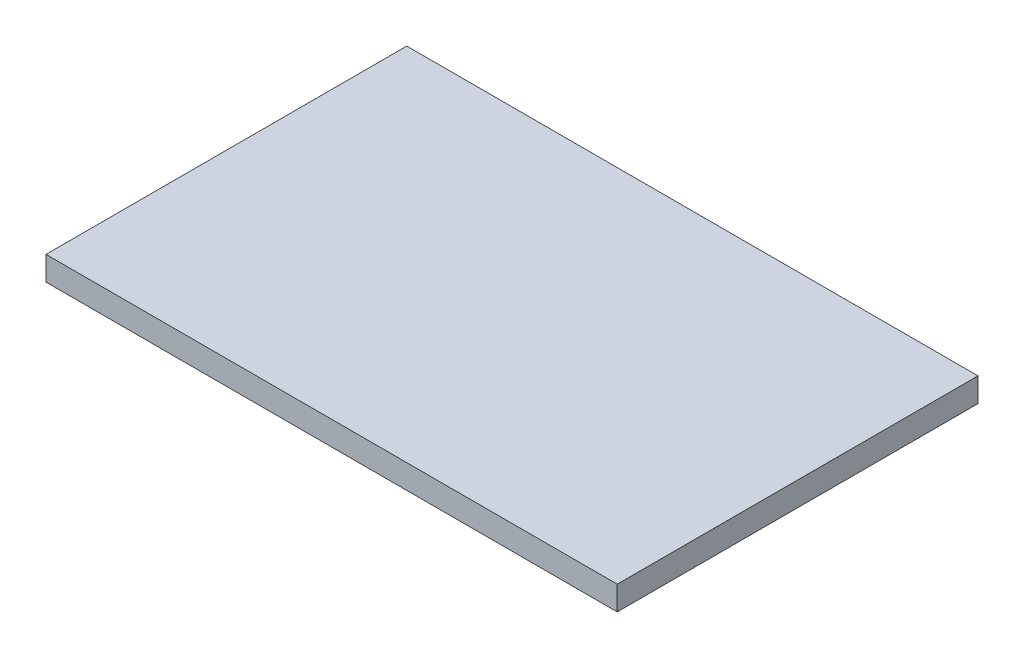
ISO-10303-21;
HEADER;
FILE_DESCRIPTION(('STEP AP214'),'2;1');
FILE_NAME('part.step','',(''),(''),'','','');
FILE_SCHEMA(('AUTOMOTIVE_DESIGN { 1 0 10303 214 1 1 1 1 }'));
ENDSEC;
DATA;
#1=APPLICATION_CONTEXT('core data for automotive mechanical design processes');
#2=APPLICATION_PROTOCOL_DEFINITION('international standard','automotive_design',2000,#1);
#3=PRODUCT_CONTEXT('',#1,'mechanical');
#4=PRODUCT('Part','Part','',(#3));
#5=PRODUCT_RELATED_PRODUCT_CATEGORY('part','',(#4));
#6=PRODUCT_DEFINITION_FORMATION('','',#4);
#7=PRODUCT_DEFINITION_CONTEXT('part definition',#1,'design');
#8=PRODUCT_DEFINITION('design','',#6,#7);
#9=PRODUCT_DEFINITION_SHAPE('','',#8);
#10=(LENGTH_UNIT() NAMED_UNIT(*) SI_UNIT(.MILLI.,.METRE.));
#11=(NAMED_UNIT(*) PLANE_ANGLE_UNIT() SI_UNIT($,.RADIAN.));
#12=(NAMED_UNIT(*) SI_UNIT($,.STERADIAN.) SOLID_ANGLE_UNIT());
#13=UNCERTAINTY_MEASURE_WITH_UNIT(LENGTH_MEASURE(1.E-05),#10,'distance_accuracy_value','');
#14=(GEOMETRIC_REPRESENTATION_CONTEXT(3) GLOBAL_UNCERTAINTY_ASSIGNED_CONTEXT((#13)) GLOBAL_UNIT_ASSIGNED_CONTEXT((#10,
#11,#12)) REPRESENTATION_CONTEXT('',''));
#15=CARTESIAN_POINT('',(0.,0.,0.));
#16=DIRECTION('',(0.,0.,1.));
#17=DIRECTION('',(1.,0.,0.));
#18=AXIS2_PLACEMENT_3D('',#15,#16,#17);
#19=CARTESIAN_POINT('',(47.5,4.,30.));
#20=DIRECTION('',(-1.,0.,0.));
#21=DIRECTION('',(0.,0.,1.));
#22=AXIS2_PLACEMENT_3D('',#19,#20,#21);
#23=PLANE('',#22);
#24=DIRECTION('',(0.,0.,-1.));
#25=VECTOR('',#24,1.);
#26=CARTESIAN_POINT('',(47.5,0.,30.));
#27=LINE('',#26,#25);
#28=CARTESIAN_POINT('',(47.5,0.,30.));
#29=VERTEX_POINT('',#28);
#30=CARTESIAN_POINT('',(47.5,0.,-30.));
#31=VERTEX_POINT('',#30);
#32=EDGE_CURVE('E98',#29,#31,#27,.T.);
#33=ORIENTED_EDGE('',*,*,#32,.T.);
#34=DIRECTION('',(0.,-1.,0.));
#35=VECTOR('',#34,1.);
#36=CARTESIAN_POINT('',(47.5,4.,-30.));
#37=LINE('',#36,#35);
#38=CARTESIAN_POINT('',(47.5,4.,-30.));
#39=VERTEX_POINT('',#38);
#40=EDGE_CURVE('E11',#39,#31,#37,.T.);
#41=ORIENTED_EDGE('',*,*,#40,.F.);
#42=DIRECTION('',(0.,0.,-1.));
#43=VECTOR('',#42,1.);
#44=CARTESIAN_POINT('',(47.5,4.,30.));
#45=LINE('',#44,#43);
#46=CARTESIAN_POINT('',(47.5,4.,30.));
#47=VERTEX_POINT('',#46);
#48=EDGE_CURVE('E86',#47,#39,#45,.T.);
#49=ORIENTED_EDGE('',*,*,#48,.F.);
#50=DIRECTION('',(0.,-1.,0.));
#51=VECTOR('',#50,1.);
#52=CARTESIAN_POINT('',(47.5,4.,30.));
#53=LINE('',#52,#51);
#54=EDGE_CURVE('E94',#47,#29,#53,.T.);
#55=ORIENTED_EDGE('',*,*,#54,.T.);
#56=EDGE_LOOP('',(#33,#41,#49,#55));
#57=FACE_BOUND('',#56,.T.);
#58=ADVANCED_FACE('F35',(#57),#23,.F.);
#59=CARTESIAN_POINT('',(-47.5,4.,-30.));
#60=DIRECTION('',(0.,0.,1.));
#61=DIRECTION('',(1.,0.,0.));
#62=AXIS2_PLACEMENT_3D('',#59,#60,#61);
#63=PLANE('',#62);
#64=DIRECTION('',(-1.,0.,0.));
#65=VECTOR('',#64,1.);
#66=CARTESIAN_POINT('',(-47.5,0.,-30.));
#67=LINE('',#66,#65);
#68=CARTESIAN_POINT('',(-47.5,0.,-30.));
#69=VERTEX_POINT('',#68);
#70=EDGE_CURVE('E90',#31,#69,#67,.T.);
#71=ORIENTED_EDGE('',*,*,#70,.T.);
#72=DIRECTION('',(0.,-1.,0.));
#73=VECTOR('',#72,1.);
#74=CARTESIAN_POINT('',(-47.5,4.,-30.));
#75=LINE('',#74,#73);
#76=CARTESIAN_POINT('',(-47.5,4.,-30.));
#77=VERTEX_POINT('',#76);
#78=EDGE_CURVE('E43',#77,#69,#75,.T.);
#79=ORIENTED_EDGE('',*,*,#78,.F.);
#80=DIRECTION('',(-1.,0.,0.));
#81=VECTOR('',#80,1.);
#82=CARTESIAN_POINT('',(-47.5,4.,-30.));
#83=LINE('',#82,#81);
#84=EDGE_CURVE('E81',#39,#77,#83,.T.);
#85=ORIENTED_EDGE('',*,*,#84,.F.);
#86=ORIENTED_EDGE('',*,*,#40,.T.);
#87=EDGE_LOOP('',(#71,#79,#85,#86));
#88=FACE_BOUND('',#87,.T.);
#89=ADVANCED_FACE('F89',(#88),#63,.F.);
#90=CARTESIAN_POINT('',(-47.5,4.,30.));
#91=DIRECTION('',(1.,0.,0.));
#92=DIRECTION('',(0.,0.,-1.));
#93=AXIS2_PLACEMENT_3D('',#90,#91,#92);
#94=PLANE('',#93);
#95=DIRECTION('',(0.,0.,1.));
#96=VECTOR('',#95,1.);
#97=CARTESIAN_POINT('',(-47.5,0.,30.));
#98=LINE('',#97,#96);
#99=CARTESIAN_POINT('',(-47.5,0.,30.));
#100=VERTEX_POINT('',#99);
#101=EDGE_CURVE('E68',#69,#100,#98,.T.);
#102=ORIENTED_EDGE('',*,*,#101,.T.);
#103=DIRECTION('',(0.,-1.,0.));
#104=VECTOR('',#103,1.);
#105=CARTESIAN_POINT('',(-47.5,4.,30.));
#106=LINE('',#105,#104);
#107=CARTESIAN_POINT('',(-47.5,4.,30.));
#108=VERTEX_POINT('',#107);
#109=EDGE_CURVE('E91',#108,#100,#106,.T.);
#110=ORIENTED_EDGE('',*,*,#109,.F.);
#111=DIRECTION('',(0.,0.,1.));
#112=VECTOR('',#111,1.);
#113=CARTESIAN_POINT('',(-47.5,4.,30.));
#114=LINE('',#113,#112);
#115=EDGE_CURVE('E84',#77,#108,#114,.T.);
#116=ORIENTED_EDGE('',*,*,#115,.F.);
#117=ORIENTED_EDGE('',*,*,#78,.T.);
#118=EDGE_LOOP('',(#102,#110,#116,#117));
#119=FACE_BOUND('',#118,.T.);
#120=ADVANCED_FACE('F92',(#119),#94,.F.);
#121=CARTESIAN_POINT('',(-47.5,4.,30.));
#122=DIRECTION('',(0.,0.,-1.));
#123=DIRECTION('',(-1.,0.,0.));
#124=AXIS2_PLACEMENT_3D('',#121,#122,#123);
#125=PLANE('',#124);
#126=DIRECTION('',(1.,0.,0.));
#127=VECTOR('',#126,1.);
#128=CARTESIAN_POINT('',(-47.5,0.,30.));
#129=LINE('',#128,#127);
#130=EDGE_CURVE('E74',#100,#29,#129,.T.);
#131=ORIENTED_EDGE('',*,*,#130,.T.);
#132=ORIENTED_EDGE('',*,*,#54,.F.);
#133=DIRECTION('',(1.,0.,0.));
#134=VECTOR('',#133,1.);
#135=CARTESIAN_POINT('',(-47.5,4.,30.));
#136=LINE('',#135,#134);
#137=EDGE_CURVE('E51',#108,#47,#136,.T.);
#138=ORIENTED_EDGE('',*,*,#137,.F.);
#139=ORIENTED_EDGE('',*,*,#109,.T.);
#140=EDGE_LOOP('',(#131,#132,#138,#139));
#141=FACE_BOUND('',#140,.T.);
#142=ADVANCED_FACE('F105',(#141),#125,.F.);
#143=CARTESIAN_POINT('',(0.,4.,0.));
#144=DIRECTION('',(0.,-1.,0.));
#145=DIRECTION('',(0.,0.,-1.));
#146=AXIS2_PLACEMENT_3D('',#143,#144,#145);
#147=PLANE('',#146);
#148=ORIENTED_EDGE('',*,*,#48,.T.);
#149=ORIENTED_EDGE('',*,*,#84,.T.);
#150=ORIENTED_EDGE('',*,*,#115,.T.);
#151=ORIENTED_EDGE('',*,*,#137,.T.);
#152=EDGE_LOOP('',(#148,#149,#150,#151));
#153=FACE_BOUND('',#152,.T.);
#154=ADVANCED_FACE('F82',(#153),#147,.F.);
#155=CARTESIAN_POINT('',(0.,0.,0.));
#156=DIRECTION('',(0.,-1.,0.));
#157=DIRECTION('',(0.,0.,-1.));
#158=AXIS2_PLACEMENT_3D('',#155,#156,#157);
#159=PLANE('',#158);
#160=ORIENTED_EDGE('',*,*,#32,.F.);
#161=ORIENTED_EDGE('',*,*,#130,.F.);
#162=ORIENTED_EDGE('',*,*,#101,.F.);
#163=ORIENTED_EDGE('',*,*,#70,.F.);
#164=EDGE_LOOP('',(#160,#161,#162,#163));
#165=FACE_BOUND('',#164,.T.);
#166=ADVANCED_FACE('F108',(#165),#159,.T.);
#167=CLOSED_SHELL('',(#58,#89,#120,#142,#154,#166));
#168=MANIFOLD_SOLID_BREP('B2',#167);
#169=ADVANCED_BREP_SHAPE_REPRESENTATION('',(#18,#168),#14);
#170=SHAPE_DEFINITION_REPRESENTATION(#9,#169);
ENDSEC;
END-ISO-10303-21;
